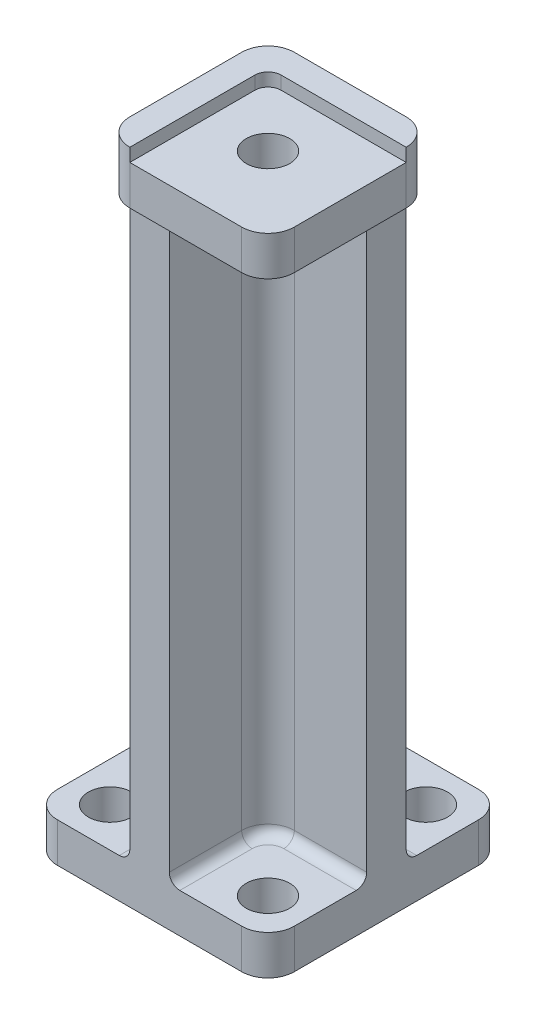
ISO-10303-21;
HEADER;
FILE_DESCRIPTION(('STEP AP214'),'2;1');
FILE_NAME('part.step','',(''),(''),'','','');
FILE_SCHEMA(('AUTOMOTIVE_DESIGN { 1 0 10303 214 1 1 1 1 }'));
ENDSEC;
DATA;
#1=APPLICATION_CONTEXT('core data for automotive mechanical design processes');
#2=APPLICATION_PROTOCOL_DEFINITION('international standard','automotive_design',2000,#1);
#3=PRODUCT_CONTEXT('',#1,'mechanical');
#4=PRODUCT('Part','Part','',(#3));
#5=PRODUCT_RELATED_PRODUCT_CATEGORY('part','',(#4));
#6=PRODUCT_DEFINITION_FORMATION('','',#4);
#7=PRODUCT_DEFINITION_CONTEXT('part definition',#1,'design');
#8=PRODUCT_DEFINITION('design','',#6,#7);
#9=PRODUCT_DEFINITION_SHAPE('','',#8);
#10=(LENGTH_UNIT() NAMED_UNIT(*) SI_UNIT(.MILLI.,.METRE.));
#11=(NAMED_UNIT(*) PLANE_ANGLE_UNIT() SI_UNIT($,.RADIAN.));
#12=(NAMED_UNIT(*) SI_UNIT($,.STERADIAN.) SOLID_ANGLE_UNIT());
#13=UNCERTAINTY_MEASURE_WITH_UNIT(LENGTH_MEASURE(1.E-05),#10,'distance_accuracy_value','');
#14=(GEOMETRIC_REPRESENTATION_CONTEXT(3) GLOBAL_UNCERTAINTY_ASSIGNED_CONTEXT((#13)) GLOBAL_UNIT_ASSIGNED_CONTEXT((#10,
#11,#12)) REPRESENTATION_CONTEXT('',''));
#15=CARTESIAN_POINT('',(0.,0.,0.));
#16=DIRECTION('',(0.,0.,1.));
#17=DIRECTION('',(1.,0.,0.));
#18=AXIS2_PLACEMENT_3D('',#15,#16,#17);
#19=CARTESIAN_POINT('',(0.,51.,0.));
#20=DIRECTION('',(0.,1.,0.));
#21=DIRECTION('',(0.,0.,1.));
#22=AXIS2_PLACEMENT_3D('',#19,#20,#21);
#23=PLANE('',#22);
#24=CARTESIAN_POINT('',(5.,51.,5.));
#25=DIRECTION('',(0.,1.,0.));
#26=DIRECTION('',(0.,0.,1.));
#27=AXIS2_PLACEMENT_3D('',#24,#25,#26);
#28=CIRCLE('',#27,1.65);
#29=CARTESIAN_POINT('',(5.,51.,6.65));
#30=VERTEX_POINT('',#29);
#31=EDGE_CURVE('E284',#30,#30,#28,.T.);
#32=ORIENTED_EDGE('',*,*,#31,.F.);
#33=EDGE_LOOP('',(#32));
#34=FACE_BOUND('',#33,.T.);
#35=DIRECTION('',(1.,0.,0.));
#36=VECTOR('',#35,1.);
#37=CARTESIAN_POINT('',(0.,51.,0.5));
#38=LINE('',#37,#36);
#39=CARTESIAN_POINT('',(1.5,51.,0.5));
#40=VERTEX_POINT('',#39);
#41=CARTESIAN_POINT('',(11.,51.,0.499999999999999));
#42=VERTEX_POINT('',#41);
#43=EDGE_CURVE('E244',#40,#42,#38,.T.);
#44=ORIENTED_EDGE('',*,*,#43,.F.);
#45=CARTESIAN_POINT('',(1.5,51.,1.5));
#46=DIRECTION('',(0.,1.,0.));
#47=DIRECTION('',(0.,0.,1.));
#48=AXIS2_PLACEMENT_3D('',#45,#46,#47);
#49=CIRCLE('',#48,1.);
#50=CARTESIAN_POINT('',(0.500000000000001,51.,1.5));
#51=VERTEX_POINT('',#50);
#52=EDGE_CURVE('E67',#40,#51,#49,.T.);
#53=ORIENTED_EDGE('',*,*,#52,.T.);
#54=DIRECTION('',(0.,0.,1.));
#55=VECTOR('',#54,1.);
#56=CARTESIAN_POINT('',(0.500000000000001,51.,0.));
#57=LINE('',#56,#55);
#58=CARTESIAN_POINT('',(0.500000000000002,51.,11.));
#59=VERTEX_POINT('',#58);
#60=EDGE_CURVE('E268',#51,#59,#57,.T.);
#61=ORIENTED_EDGE('',*,*,#60,.T.);
#62=DIRECTION('',(1.,0.,0.));
#63=VECTOR('',#62,1.);
#64=CARTESIAN_POINT('',(-1.5,51.,11.));
#65=LINE('',#64,#63);
#66=CARTESIAN_POINT('',(9.00000000000001,51.,11.));
#67=VERTEX_POINT('',#66);
#68=EDGE_CURVE('E292',#59,#67,#65,.T.);
#69=ORIENTED_EDGE('',*,*,#68,.T.);
#70=CARTESIAN_POINT('',(9.00000000000001,51.,9.));
#71=DIRECTION('',(0.,1.,0.));
#72=DIRECTION('',(0.,0.,1.));
#73=AXIS2_PLACEMENT_3D('',#70,#71,#72);
#74=CIRCLE('',#73,2.);
#75=CARTESIAN_POINT('',(11.,51.,9.));
#76=VERTEX_POINT('',#75);
#77=EDGE_CURVE('E415',#67,#76,#74,.T.);
#78=ORIENTED_EDGE('',*,*,#77,.T.);
#79=DIRECTION('',(0.,0.,-1.));
#80=VECTOR('',#79,1.);
#81=CARTESIAN_POINT('',(11.,51.,-1.5));
#82=LINE('',#81,#80);
#83=EDGE_CURVE('E295',#76,#42,#82,.T.);
#84=ORIENTED_EDGE('',*,*,#83,.T.);
#85=EDGE_LOOP('',(#44,#53,#61,#69,#78,#84));
#86=FACE_BOUND('',#85,.T.);
#87=ADVANCED_FACE('F45',(#34,#86),#23,.T.);
#88=CARTESIAN_POINT('',(0.,3.,0.));
#89=DIRECTION('',(0.,1.,0.));
#90=DIRECTION('',(0.,0.,1.));
#91=AXIS2_PLACEMENT_3D('',#88,#89,#90);
#92=PLANE('',#91);
#93=CARTESIAN_POINT('',(0.500000000000001,3.,0.5));
#94=DIRECTION('',(0.,1.,0.));
#95=DIRECTION('',(0.,0.,1.));
#96=AXIS2_PLACEMENT_3D('',#93,#94,#95);
#97=CIRCLE('',#96,2.8);
#98=CARTESIAN_POINT('',(-2.3,3.,0.5));
#99=VERTEX_POINT('',#98);
#100=CARTESIAN_POINT('',(0.500000000000001,3.,-2.3));
#101=VERTEX_POINT('',#100);
#102=EDGE_CURVE('E444',#99,#101,#97,.F.);
#103=ORIENTED_EDGE('',*,*,#102,.T.);
#104=DIRECTION('',(1.,0.,0.));
#105=VECTOR('',#104,1.);
#106=CARTESIAN_POINT('',(9.,3.,-2.3));
#107=LINE('',#106,#105);
#108=CARTESIAN_POINT('',(9.,3.,-2.3));
#109=VERTEX_POINT('',#108);
#110=EDGE_CURVE('E446',#101,#109,#107,.T.);
#111=ORIENTED_EDGE('',*,*,#110,.T.);
#112=DIRECTION('',(0.,0.,-1.));
#113=VECTOR('',#112,1.);
#114=CARTESIAN_POINT('',(9.,3.,-9.));
#115=LINE('',#114,#113);
#116=CARTESIAN_POINT('',(9.,3.,-7.));
#117=VERTEX_POINT('',#116);
#118=EDGE_CURVE('E349',#109,#117,#115,.T.);
#119=ORIENTED_EDGE('',*,*,#118,.T.);
#120=CARTESIAN_POINT('',(7.,3.,-7.));
#121=DIRECTION('',(0.,1.,0.));
#122=DIRECTION('',(0.,0.,1.));
#123=AXIS2_PLACEMENT_3D('',#120,#121,#122);
#124=CIRCLE('',#123,2.);
#125=CARTESIAN_POINT('',(7.,3.,-9.));
#126=VERTEX_POINT('',#125);
#127=EDGE_CURVE('E382',#117,#126,#124,.T.);
#128=ORIENTED_EDGE('',*,*,#127,.T.);
#129=DIRECTION('',(-1.,0.,0.));
#130=VECTOR('',#129,1.);
#131=CARTESIAN_POINT('',(-9.,3.,-9.));
#132=LINE('',#131,#130);
#133=CARTESIAN_POINT('',(-0.974802815289284,3.,-9.));
#134=VERTEX_POINT('',#133);
#135=EDGE_CURVE('E348',#126,#134,#132,.T.);
#136=ORIENTED_EDGE('',*,*,#135,.T.);
#137=DIRECTION('',(0.679286233467327,0.,-0.733873431200348));
#138=VECTOR('',#137,1.);
#139=CARTESIAN_POINT('',(-9.,3.,-0.32990085204443));
#140=LINE('',#139,#138);
#141=CARTESIAN_POINT('',(-9.,3.,-0.32990085204443));
#142=VERTEX_POINT('',#141);
#143=EDGE_CURVE('E277',#142,#134,#140,.T.);
#144=ORIENTED_EDGE('',*,*,#143,.F.);
#145=DIRECTION('',(0.,0.,1.));
#146=VECTOR('',#145,1.);
#147=CARTESIAN_POINT('',(-9.,3.,-9.));
#148=LINE('',#147,#146);
#149=CARTESIAN_POINT('',(-8.99999999999999,3.,7.));
#150=VERTEX_POINT('',#149);
#151=EDGE_CURVE('E351',#142,#150,#148,.T.);
#152=ORIENTED_EDGE('',*,*,#151,.T.);
#153=CARTESIAN_POINT('',(-6.99999999999999,3.,7.));
#154=DIRECTION('',(0.,1.,0.));
#155=DIRECTION('',(0.,0.,1.));
#156=AXIS2_PLACEMENT_3D('',#153,#154,#155);
#157=CIRCLE('',#156,2.);
#158=CARTESIAN_POINT('',(-6.99999999999999,3.,9.));
#159=VERTEX_POINT('',#158);
#160=EDGE_CURVE('E384',#150,#159,#157,.T.);
#161=ORIENTED_EDGE('',*,*,#160,.T.);
#162=DIRECTION('',(1.,0.,0.));
#163=VECTOR('',#162,1.);
#164=CARTESIAN_POINT('',(-8.99999999999999,3.,9.));
#165=LINE('',#164,#163);
#166=CARTESIAN_POINT('',(-2.3,3.,9.));
#167=VERTEX_POINT('',#166);
#168=EDGE_CURVE('E355',#159,#167,#165,.T.);
#169=ORIENTED_EDGE('',*,*,#168,.T.);
#170=DIRECTION('',(0.,0.,-1.));
#171=VECTOR('',#170,1.);
#172=CARTESIAN_POINT('',(-2.3,3.,0.5));
#173=LINE('',#172,#171);
#174=EDGE_CURVE('E442',#167,#99,#173,.T.);
#175=ORIENTED_EDGE('',*,*,#174,.T.);
#176=EDGE_LOOP('',(#103,#111,#119,#128,#136,#144,#152,#161,#169,#175));
#177=FACE_BOUND('',#176,.T.);
#178=CARTESIAN_POINT('',(-6.00000000000006,3.,5.99999999999994));
#179=DIRECTION('',(0.,1.,0.));
#180=DIRECTION('',(0.,0.,1.));
#181=AXIS2_PLACEMENT_3D('',#178,#179,#180);
#182=CIRCLE('',#181,1.65);
#183=CARTESIAN_POINT('',(-6.00000000000006,3.,7.64999999999994));
#184=VERTEX_POINT('',#183);
#185=EDGE_CURVE('E340',#184,#184,#182,.T.);
#186=ORIENTED_EDGE('',*,*,#185,.F.);
#187=EDGE_LOOP('',(#186));
#188=FACE_BOUND('',#187,.T.);
#189=CARTESIAN_POINT('',(6.00000000000002,3.,-5.99999999999998));
#190=DIRECTION('',(0.,1.,0.));
#191=DIRECTION('',(0.,0.,1.));
#192=AXIS2_PLACEMENT_3D('',#189,#190,#191);
#193=CIRCLE('',#192,1.65);
#194=CARTESIAN_POINT('',(6.00000000000002,3.,-4.34999999999998));
#195=VERTEX_POINT('',#194);
#196=EDGE_CURVE('E327',#195,#195,#193,.T.);
#197=ORIENTED_EDGE('',*,*,#196,.F.);
#198=EDGE_LOOP('',(#197));
#199=FACE_BOUND('',#198,.T.);
#200=ADVANCED_FACE('F538',(#177,#188,#199),#92,.T.);
#201=CARTESIAN_POINT('',(5.99999999999996,3.,6.00000000000004));
#202=DIRECTION('',(0.,1.,0.));
#203=DIRECTION('',(0.,0.,1.));
#204=AXIS2_PLACEMENT_3D('',#201,#202,#203);
#205=CIRCLE('',#204,1.65);
#206=CARTESIAN_POINT('',(5.99999999999996,3.,7.65000000000004));
#207=VERTEX_POINT('',#206);
#208=EDGE_CURVE('E334',#207,#207,#205,.T.);
#209=ORIENTED_EDGE('',*,*,#208,.F.);
#210=EDGE_LOOP('',(#209));
#211=FACE_BOUND('',#210,.T.);
#212=CARTESIAN_POINT('',(9.00000000000001,3.,7.));
#213=VERTEX_POINT('',#212);
#214=CARTESIAN_POINT('',(9.,3.,2.3));
#215=VERTEX_POINT('',#214);
#216=EDGE_CURVE('E345',#213,#215,#115,.T.);
#217=ORIENTED_EDGE('',*,*,#216,.T.);
#218=DIRECTION('',(-1.,0.,0.));
#219=VECTOR('',#218,1.);
#220=CARTESIAN_POINT('',(3.5,3.,2.3));
#221=LINE('',#220,#219);
#222=CARTESIAN_POINT('',(3.5,3.,2.3));
#223=VERTEX_POINT('',#222);
#224=EDGE_CURVE('E435',#215,#223,#221,.T.);
#225=ORIENTED_EDGE('',*,*,#224,.T.);
#226=CARTESIAN_POINT('',(3.5,3.,3.5));
#227=DIRECTION('',(0.,1.,0.));
#228=DIRECTION('',(0.,0.,1.));
#229=AXIS2_PLACEMENT_3D('',#226,#227,#228);
#230=CIRCLE('',#229,1.2);
#231=CARTESIAN_POINT('',(2.3,3.,3.5));
#232=VERTEX_POINT('',#231);
#233=EDGE_CURVE('E433',#223,#232,#230,.T.);
#234=ORIENTED_EDGE('',*,*,#233,.T.);
#235=DIRECTION('',(0.,0.,-1.));
#236=VECTOR('',#235,1.);
#237=CARTESIAN_POINT('',(2.3,3.,0.));
#238=LINE('',#237,#236);
#239=CARTESIAN_POINT('',(2.3,3.,9.));
#240=VERTEX_POINT('',#239);
#241=EDGE_CURVE('E431',#232,#240,#238,.F.);
#242=ORIENTED_EDGE('',*,*,#241,.T.);
#243=CARTESIAN_POINT('',(7.00000000000001,3.,9.));
#244=VERTEX_POINT('',#243);
#245=EDGE_CURVE('E354',#240,#244,#165,.T.);
#246=ORIENTED_EDGE('',*,*,#245,.T.);
#247=CARTESIAN_POINT('',(7.,3.,7.));
#248=DIRECTION('',(0.,1.,0.));
#249=DIRECTION('',(0.,0.,1.));
#250=AXIS2_PLACEMENT_3D('',#247,#248,#249);
#251=CIRCLE('',#250,2.);
#252=EDGE_CURVE('E392',#244,#213,#251,.T.);
#253=ORIENTED_EDGE('',*,*,#252,.T.);
#254=EDGE_LOOP('',(#217,#225,#234,#242,#246,#253));
#255=FACE_BOUND('',#254,.T.);
#256=ADVANCED_FACE('F516',(#211,#255),#92,.T.);
#257=CARTESIAN_POINT('',(9.,3.,-9.));
#258=DIRECTION('',(-1.,0.,0.));
#259=DIRECTION('',(0.,0.,1.));
#260=AXIS2_PLACEMENT_3D('',#257,#258,#259);
#261=PLANE('',#260);
#262=ORIENTED_EDGE('',*,*,#216,.F.);
#263=DIRECTION('',(0.,-1.,0.));
#264=VECTOR('',#263,1.);
#265=CARTESIAN_POINT('',(9.00000000000001,3.,7.));
#266=LINE('',#265,#264);
#267=CARTESIAN_POINT('',(9.00000000000001,0.,7.));
#268=VERTEX_POINT('',#267);
#269=EDGE_CURVE('E389',#213,#268,#266,.T.);
#270=ORIENTED_EDGE('',*,*,#269,.T.);
#271=DIRECTION('',(0.,0.,-1.));
#272=VECTOR('',#271,1.);
#273=CARTESIAN_POINT('',(9.,0.,-9.));
#274=LINE('',#273,#272);
#275=CARTESIAN_POINT('',(9.,0.,-7.));
#276=VERTEX_POINT('',#275);
#277=EDGE_CURVE('E330',#268,#276,#274,.T.);
#278=ORIENTED_EDGE('',*,*,#277,.T.);
#279=DIRECTION('',(0.,-1.,0.));
#280=VECTOR('',#279,1.);
#281=CARTESIAN_POINT('',(9.,3.,-7.));
#282=LINE('',#281,#280);
#283=EDGE_CURVE('E386',#276,#117,#282,.F.);
#284=ORIENTED_EDGE('',*,*,#283,.T.);
#285=ORIENTED_EDGE('',*,*,#118,.F.);
#286=CARTESIAN_POINT('',(9.,3.8,-2.3));
#287=DIRECTION('',(-1.,0.,0.));
#288=DIRECTION('',(0.,0.,1.));
#289=AXIS2_PLACEMENT_3D('',#286,#287,#288);
#290=CIRCLE('',#289,0.8);
#291=CARTESIAN_POINT('',(9.,3.80000000000001,-1.5));
#292=VERTEX_POINT('',#291);
#293=EDGE_CURVE('E459',#109,#292,#290,.T.);
#294=ORIENTED_EDGE('',*,*,#293,.T.);
#295=DIRECTION('',(0.,-1.,0.));
#296=VECTOR('',#295,1.);
#297=CARTESIAN_POINT('',(9.,48.,-1.5));
#298=LINE('',#297,#296);
#299=CARTESIAN_POINT('',(9.,48.,-1.5));
#300=VERTEX_POINT('',#299);
#301=EDGE_CURVE('E314',#300,#292,#298,.T.);
#302=ORIENTED_EDGE('',*,*,#301,.F.);
#303=DIRECTION('',(0.,0.,-1.));
#304=VECTOR('',#303,1.);
#305=CARTESIAN_POINT('',(9.,48.,0.));
#306=LINE('',#305,#304);
#307=CARTESIAN_POINT('',(9.,48.,1.5));
#308=VERTEX_POINT('',#307);
#309=EDGE_CURVE('E311',#308,#300,#306,.T.);
#310=ORIENTED_EDGE('',*,*,#309,.F.);
#311=DIRECTION('',(0.,-1.,0.));
#312=VECTOR('',#311,1.);
#313=CARTESIAN_POINT('',(9.,48.,1.5));
#314=LINE('',#313,#312);
#315=CARTESIAN_POINT('',(9.,3.80000000000001,1.5));
#316=VERTEX_POINT('',#315);
#317=EDGE_CURVE('E317',#308,#316,#314,.T.);
#318=ORIENTED_EDGE('',*,*,#317,.T.);
#319=CARTESIAN_POINT('',(9.,3.8,2.3));
#320=DIRECTION('',(-1.,0.,0.));
#321=DIRECTION('',(0.,0.,1.));
#322=AXIS2_PLACEMENT_3D('',#319,#320,#321);
#323=CIRCLE('',#322,0.8);
#324=EDGE_CURVE('E457',#316,#215,#323,.T.);
#325=ORIENTED_EDGE('',*,*,#324,.T.);
#326=EDGE_LOOP('',(#262,#270,#278,#284,#285,#294,#302,#310,#318,#325));
#327=FACE_BOUND('',#326,.T.);
#328=ADVANCED_FACE('F491',(#327),#261,.F.);
#329=CARTESIAN_POINT('',(-9.,3.,-9.));
#330=DIRECTION('',(0.,0.,1.));
#331=DIRECTION('',(1.,0.,0.));
#332=AXIS2_PLACEMENT_3D('',#329,#330,#331);
#333=PLANE('',#332);
#334=ORIENTED_EDGE('',*,*,#135,.F.);
#335=DIRECTION('',(0.,-1.,0.));
#336=VECTOR('',#335,1.);
#337=CARTESIAN_POINT('',(7.,3.,-9.));
#338=LINE('',#337,#336);
#339=CARTESIAN_POINT('',(7.,0.,-9.));
#340=VERTEX_POINT('',#339);
#341=EDGE_CURVE('E394',#126,#340,#338,.T.);
#342=ORIENTED_EDGE('',*,*,#341,.T.);
#343=DIRECTION('',(-1.,0.,0.));
#344=VECTOR('',#343,1.);
#345=CARTESIAN_POINT('',(-9.,0.,-9.));
#346=LINE('',#345,#344);
#347=CARTESIAN_POINT('',(-0.974802815289286,0.,-9.));
#348=VERTEX_POINT('',#347);
#349=EDGE_CURVE('E361',#340,#348,#346,.T.);
#350=ORIENTED_EDGE('',*,*,#349,.T.);
#351=DIRECTION('',(0.,1.,0.));
#352=VECTOR('',#351,1.);
#353=CARTESIAN_POINT('',(-0.974802815289284,0.,-9.));
#354=LINE('',#353,#352);
#355=EDGE_CURVE('E281',#348,#134,#354,.T.);
#356=ORIENTED_EDGE('',*,*,#355,.T.);
#357=EDGE_LOOP('',(#334,#342,#350,#356));
#358=FACE_BOUND('',#357,.T.);
#359=ADVANCED_FACE('F534',(#358),#333,.F.);
#360=CARTESIAN_POINT('',(-9.,3.,-9.));
#361=DIRECTION('',(1.,0.,0.));
#362=DIRECTION('',(0.,0.,-1.));
#363=AXIS2_PLACEMENT_3D('',#360,#361,#362);
#364=PLANE('',#363);
#365=DIRECTION('',(0.,0.,1.));
#366=VECTOR('',#365,1.);
#367=CARTESIAN_POINT('',(-9.,0.,-9.));
#368=LINE('',#367,#366);
#369=CARTESIAN_POINT('',(-9.,0.,-0.32990085204443));
#370=VERTEX_POINT('',#369);
#371=CARTESIAN_POINT('',(-8.99999999999999,0.,7.));
#372=VERTEX_POINT('',#371);
#373=EDGE_CURVE('E363',#370,#372,#368,.T.);
#374=ORIENTED_EDGE('',*,*,#373,.T.);
#375=DIRECTION('',(0.,-1.,0.));
#376=VECTOR('',#375,1.);
#377=CARTESIAN_POINT('',(-8.99999999999999,3.,7.));
#378=LINE('',#377,#376);
#379=EDGE_CURVE('E380',#372,#150,#378,.F.);
#380=ORIENTED_EDGE('',*,*,#379,.T.);
#381=ORIENTED_EDGE('',*,*,#151,.F.);
#382=DIRECTION('',(0.,1.,0.));
#383=VECTOR('',#382,1.);
#384=CARTESIAN_POINT('',(-9.,0.,-0.32990085204443));
#385=LINE('',#384,#383);
#386=EDGE_CURVE('E276',#370,#142,#385,.T.);
#387=ORIENTED_EDGE('',*,*,#386,.F.);
#388=EDGE_LOOP('',(#374,#380,#381,#387));
#389=FACE_BOUND('',#388,.T.);
#390=ADVANCED_FACE('F546',(#389),#364,.F.);
#391=CARTESIAN_POINT('',(-8.99999999999999,3.,9.));
#392=DIRECTION('',(0.,0.,-1.));
#393=DIRECTION('',(-1.,0.,0.));
#394=AXIS2_PLACEMENT_3D('',#391,#392,#393);
#395=PLANE('',#394);
#396=ORIENTED_EDGE('',*,*,#168,.F.);
#397=DIRECTION('',(0.,-1.,0.));
#398=VECTOR('',#397,1.);
#399=CARTESIAN_POINT('',(-6.99999999999999,3.,9.));
#400=LINE('',#399,#398);
#401=CARTESIAN_POINT('',(-6.99999999999999,0.,9.));
#402=VERTEX_POINT('',#401);
#403=EDGE_CURVE('E371',#159,#402,#400,.T.);
#404=ORIENTED_EDGE('',*,*,#403,.T.);
#405=DIRECTION('',(1.,0.,0.));
#406=VECTOR('',#405,1.);
#407=CARTESIAN_POINT('',(-8.99999999999999,0.,9.));
#408=LINE('',#407,#406);
#409=CARTESIAN_POINT('',(7.00000000000001,0.,9.));
#410=VERTEX_POINT('',#409);
#411=EDGE_CURVE('E366',#402,#410,#408,.T.);
#412=ORIENTED_EDGE('',*,*,#411,.T.);
#413=DIRECTION('',(0.,-1.,0.));
#414=VECTOR('',#413,1.);
#415=CARTESIAN_POINT('',(7.00000000000001,3.,9.));
#416=LINE('',#415,#414);
#417=EDGE_CURVE('E358',#410,#244,#416,.F.);
#418=ORIENTED_EDGE('',*,*,#417,.T.);
#419=ORIENTED_EDGE('',*,*,#245,.F.);
#420=CARTESIAN_POINT('',(2.3,3.8,9.));
#421=DIRECTION('',(0.,0.,-1.));
#422=DIRECTION('',(-1.,0.,0.));
#423=AXIS2_PLACEMENT_3D('',#420,#421,#422);
#424=CIRCLE('',#423,0.8);
#425=CARTESIAN_POINT('',(1.5,3.80000000000001,9.));
#426=VERTEX_POINT('',#425);
#427=EDGE_CURVE('E461',#240,#426,#424,.T.);
#428=ORIENTED_EDGE('',*,*,#427,.T.);
#429=DIRECTION('',(0.,-1.,0.));
#430=VECTOR('',#429,1.);
#431=CARTESIAN_POINT('',(1.5,48.,9.));
#432=LINE('',#431,#430);
#433=CARTESIAN_POINT('',(1.5,48.,9.));
#434=VERTEX_POINT('',#433);
#435=EDGE_CURVE('E320',#434,#426,#432,.T.);
#436=ORIENTED_EDGE('',*,*,#435,.F.);
#437=DIRECTION('',(1.,0.,0.));
#438=VECTOR('',#437,1.);
#439=CARTESIAN_POINT('',(0.,48.,9.));
#440=LINE('',#439,#438);
#441=CARTESIAN_POINT('',(-1.5,48.,9.));
#442=VERTEX_POINT('',#441);
#443=EDGE_CURVE('E298',#442,#434,#440,.T.);
#444=ORIENTED_EDGE('',*,*,#443,.F.);
#445=DIRECTION('',(0.,-1.,0.));
#446=VECTOR('',#445,1.);
#447=CARTESIAN_POINT('',(-1.5,48.,9.));
#448=LINE('',#447,#446);
#449=CARTESIAN_POINT('',(-1.5,3.80000000000001,9.));
#450=VERTEX_POINT('',#449);
#451=EDGE_CURVE('E323',#442,#450,#448,.T.);
#452=ORIENTED_EDGE('',*,*,#451,.T.);
#453=CARTESIAN_POINT('',(-2.3,3.8,9.));
#454=DIRECTION('',(0.,0.,-1.));
#455=DIRECTION('',(-1.,0.,0.));
#456=AXIS2_PLACEMENT_3D('',#453,#454,#455);
#457=CIRCLE('',#456,0.8);
#458=EDGE_CURVE('E463',#450,#167,#457,.T.);
#459=ORIENTED_EDGE('',*,*,#458,.T.);
#460=EDGE_LOOP('',(#396,#404,#412,#418,#419,#428,#436,#444,#452,#459));
#461=FACE_BOUND('',#460,.T.);
#462=ADVANCED_FACE('F554',(#461),#395,.F.);
#463=CARTESIAN_POINT('',(0.,0.,0.));
#464=DIRECTION('',(0.,1.,0.));
#465=DIRECTION('',(0.,0.,1.));
#466=AXIS2_PLACEMENT_3D('',#463,#464,#465);
#467=PLANE('',#466);
#468=CARTESIAN_POINT('',(-6.00000000000006,0.,5.99999999999994));
#469=DIRECTION('',(0.,1.,0.));
#470=DIRECTION('',(0.,0.,1.));
#471=AXIS2_PLACEMENT_3D('',#468,#469,#470);
#472=CIRCLE('',#471,1.65);
#473=CARTESIAN_POINT('',(-6.00000000000006,0.,7.64999999999994));
#474=VERTEX_POINT('',#473);
#475=EDGE_CURVE('E326',#474,#474,#472,.T.);
#476=ORIENTED_EDGE('',*,*,#475,.T.);
#477=EDGE_LOOP('',(#476));
#478=FACE_BOUND('',#477,.T.);
#479=CARTESIAN_POINT('',(5.99999999999996,0.,6.00000000000004));
#480=DIRECTION('',(0.,1.,0.));
#481=DIRECTION('',(0.,0.,1.));
#482=AXIS2_PLACEMENT_3D('',#479,#480,#481);
#483=CIRCLE('',#482,1.65);
#484=CARTESIAN_POINT('',(5.99999999999996,0.,7.65000000000004));
#485=VERTEX_POINT('',#484);
#486=EDGE_CURVE('E337',#485,#485,#483,.T.);
#487=ORIENTED_EDGE('',*,*,#486,.T.);
#488=EDGE_LOOP('',(#487));
#489=FACE_BOUND('',#488,.T.);
#490=CARTESIAN_POINT('',(6.00000000000002,0.,-5.99999999999998));
#491=DIRECTION('',(0.,1.,0.));
#492=DIRECTION('',(0.,0.,1.));
#493=AXIS2_PLACEMENT_3D('',#490,#491,#492);
#494=CIRCLE('',#493,1.65);
#495=CARTESIAN_POINT('',(6.00000000000002,0.,-4.34999999999998));
#496=VERTEX_POINT('',#495);
#497=EDGE_CURVE('E331',#496,#496,#494,.T.);
#498=ORIENTED_EDGE('',*,*,#497,.T.);
#499=EDGE_LOOP('',(#498));
#500=FACE_BOUND('',#499,.T.);
#501=ORIENTED_EDGE('',*,*,#411,.F.);
#502=CARTESIAN_POINT('',(-6.99999999999999,0.,7.));
#503=DIRECTION('',(0.,1.,0.));
#504=DIRECTION('',(0.,0.,1.));
#505=AXIS2_PLACEMENT_3D('',#502,#503,#504);
#506=CIRCLE('',#505,2.);
#507=EDGE_CURVE('E378',#402,#372,#506,.F.);
#508=ORIENTED_EDGE('',*,*,#507,.T.);
#509=ORIENTED_EDGE('',*,*,#373,.F.);
#510=DIRECTION('',(0.679286233467327,0.,-0.733873431200348));
#511=VECTOR('',#510,1.);
#512=CARTESIAN_POINT('',(-9.,0.,-0.32990085204443));
#513=LINE('',#512,#511);
#514=EDGE_CURVE('E273',#370,#348,#513,.T.);
#515=ORIENTED_EDGE('',*,*,#514,.T.);
#516=ORIENTED_EDGE('',*,*,#349,.F.);
#517=CARTESIAN_POINT('',(7.,0.,-7.));
#518=DIRECTION('',(0.,1.,0.));
#519=DIRECTION('',(0.,0.,1.));
#520=AXIS2_PLACEMENT_3D('',#517,#518,#519);
#521=CIRCLE('',#520,2.);
#522=EDGE_CURVE('E374',#340,#276,#521,.F.);
#523=ORIENTED_EDGE('',*,*,#522,.T.);
#524=ORIENTED_EDGE('',*,*,#277,.F.);
#525=CARTESIAN_POINT('',(7.,0.,7.));
#526=DIRECTION('',(0.,1.,0.));
#527=DIRECTION('',(0.,0.,1.));
#528=AXIS2_PLACEMENT_3D('',#525,#526,#527);
#529=CIRCLE('',#528,2.);
#530=EDGE_CURVE('E376',#268,#410,#529,.F.);
#531=ORIENTED_EDGE('',*,*,#530,.T.);
#532=EDGE_LOOP('',(#501,#508,#509,#515,#516,#523,#524,#531));
#533=FACE_BOUND('',#532,.T.);
#534=ADVANCED_FACE('F526',(#478,#489,#500,#533),#467,.F.);
#535=CARTESIAN_POINT('',(6.00000000000002,0.,-5.99999999999998));
#536=DIRECTION('',(0.,1.,0.));
#537=DIRECTION('',(0.,0.,1.));
#538=AXIS2_PLACEMENT_3D('',#535,#536,#537);
#539=CYLINDRICAL_SURFACE('',#538,1.65);
#540=ORIENTED_EDGE('',*,*,#497,.F.);
#541=EDGE_LOOP('',(#540));
#542=FACE_BOUND('',#541,.T.);
#543=ORIENTED_EDGE('',*,*,#196,.T.);
#544=EDGE_LOOP('',(#543));
#545=FACE_BOUND('',#544,.T.);
#546=ADVANCED_FACE('F623',(#542,#545),#539,.F.);
#547=CARTESIAN_POINT('',(5.99999999999996,0.,6.00000000000004));
#548=DIRECTION('',(0.,1.,0.));
#549=DIRECTION('',(0.,0.,1.));
#550=AXIS2_PLACEMENT_3D('',#547,#548,#549);
#551=CYLINDRICAL_SURFACE('',#550,1.65);
#552=ORIENTED_EDGE('',*,*,#486,.F.);
#553=EDGE_LOOP('',(#552));
#554=FACE_BOUND('',#553,.T.);
#555=ORIENTED_EDGE('',*,*,#208,.T.);
#556=EDGE_LOOP('',(#555));
#557=FACE_BOUND('',#556,.T.);
#558=ADVANCED_FACE('F626',(#554,#557),#551,.F.);
#559=CARTESIAN_POINT('',(-6.00000000000006,0.,5.99999999999994));
#560=DIRECTION('',(0.,1.,0.));
#561=DIRECTION('',(0.,0.,1.));
#562=AXIS2_PLACEMENT_3D('',#559,#560,#561);
#563=CYLINDRICAL_SURFACE('',#562,1.65);
#564=ORIENTED_EDGE('',*,*,#475,.F.);
#565=EDGE_LOOP('',(#564));
#566=FACE_BOUND('',#565,.T.);
#567=ORIENTED_EDGE('',*,*,#185,.T.);
#568=EDGE_LOOP('',(#567));
#569=FACE_BOUND('',#568,.T.);
#570=ADVANCED_FACE('F622',(#566,#569),#563,.F.);
#571=CARTESIAN_POINT('',(-1.5,48.,0.));
#572=DIRECTION('',(-1.,0.,0.));
#573=DIRECTION('',(0.,0.,1.));
#574=AXIS2_PLACEMENT_3D('',#571,#572,#573);
#575=PLANE('',#574);
#576=DIRECTION('',(0.,-1.,0.));
#577=VECTOR('',#576,1.);
#578=CARTESIAN_POINT('',(-1.5,48.,0.5));
#579=LINE('',#578,#577);
#580=CARTESIAN_POINT('',(-1.5,52.,0.5));
#581=VERTEX_POINT('',#580);
#582=CARTESIAN_POINT('',(-1.5,3.8,0.5));
#583=VERTEX_POINT('',#582);
#584=EDGE_CURVE('E410',#581,#583,#579,.T.);
#585=ORIENTED_EDGE('',*,*,#584,.T.);
#586=DIRECTION('',(0.,0.,-1.));
#587=VECTOR('',#586,1.);
#588=CARTESIAN_POINT('',(-1.5,3.8,9.));
#589=LINE('',#588,#587);
#590=EDGE_CURVE('E455',#583,#450,#589,.F.);
#591=ORIENTED_EDGE('',*,*,#590,.T.);
#592=ORIENTED_EDGE('',*,*,#451,.F.);
#593=DIRECTION('',(0.,-1.,0.));
#594=VECTOR('',#593,1.);
#595=CARTESIAN_POINT('',(-1.5,51.,9.));
#596=LINE('',#595,#594);
#597=CARTESIAN_POINT('',(-1.5,52.,9.));
#598=VERTEX_POINT('',#597);
#599=EDGE_CURVE('E413',#442,#598,#596,.F.);
#600=ORIENTED_EDGE('',*,*,#599,.T.);
#601=DIRECTION('',(0.,0.,1.));
#602=VECTOR('',#601,1.);
#603=CARTESIAN_POINT('',(-1.5,52.,0.));
#604=LINE('',#603,#602);
#605=EDGE_CURVE('E262',#581,#598,#604,.T.);
#606=ORIENTED_EDGE('',*,*,#605,.F.);
#607=EDGE_LOOP('',(#585,#591,#592,#600,#606));
#608=FACE_BOUND('',#607,.T.);
#609=ADVANCED_FACE('F576',(#608),#575,.T.);
#610=CARTESIAN_POINT('',(1.5,48.,0.));
#611=DIRECTION('',(-1.,0.,0.));
#612=DIRECTION('',(0.,0.,1.));
#613=AXIS2_PLACEMENT_3D('',#610,#611,#612);
#614=PLANE('',#613);
#615=ORIENTED_EDGE('',*,*,#435,.T.);
#616=DIRECTION('',(0.,0.,-1.));
#617=VECTOR('',#616,1.);
#618=CARTESIAN_POINT('',(1.5,3.8,0.));
#619=LINE('',#618,#617);
#620=CARTESIAN_POINT('',(1.5,3.8,3.5));
#621=VERTEX_POINT('',#620);
#622=EDGE_CURVE('E453',#426,#621,#619,.T.);
#623=ORIENTED_EDGE('',*,*,#622,.T.);
#624=DIRECTION('',(0.,-1.,0.));
#625=VECTOR('',#624,1.);
#626=CARTESIAN_POINT('',(1.5,48.,3.5));
#627=LINE('',#626,#625);
#628=CARTESIAN_POINT('',(1.5,48.,3.5));
#629=VERTEX_POINT('',#628);
#630=EDGE_CURVE('E429',#621,#629,#627,.F.);
#631=ORIENTED_EDGE('',*,*,#630,.T.);
#632=DIRECTION('',(0.,0.,-1.));
#633=VECTOR('',#632,1.);
#634=CARTESIAN_POINT('',(1.5,48.,0.));
#635=LINE('',#634,#633);
#636=EDGE_CURVE('E305',#434,#629,#635,.T.);
#637=ORIENTED_EDGE('',*,*,#636,.F.);
#638=EDGE_LOOP('',(#615,#623,#631,#637));
#639=FACE_BOUND('',#638,.T.);
#640=ADVANCED_FACE('F616',(#639),#614,.F.);
#641=CARTESIAN_POINT('',(0.,48.,1.5));
#642=DIRECTION('',(0.,0.,1.));
#643=DIRECTION('',(1.,0.,0.));
#644=AXIS2_PLACEMENT_3D('',#641,#642,#643);
#645=PLANE('',#644);
#646=DIRECTION('',(0.,-1.,0.));
#647=VECTOR('',#646,1.);
#648=CARTESIAN_POINT('',(3.5,48.,1.5));
#649=LINE('',#648,#647);
#650=CARTESIAN_POINT('',(3.5,48.,1.5));
#651=VERTEX_POINT('',#650);
#652=CARTESIAN_POINT('',(3.5,3.8,1.5));
#653=VERTEX_POINT('',#652);
#654=EDGE_CURVE('E426',#651,#653,#649,.T.);
#655=ORIENTED_EDGE('',*,*,#654,.T.);
#656=DIRECTION('',(-1.,0.,0.));
#657=VECTOR('',#656,1.);
#658=CARTESIAN_POINT('',(9.,3.8,1.5));
#659=LINE('',#658,#657);
#660=EDGE_CURVE('E438',#653,#316,#659,.F.);
#661=ORIENTED_EDGE('',*,*,#660,.T.);
#662=ORIENTED_EDGE('',*,*,#317,.F.);
#663=DIRECTION('',(-1.,0.,0.));
#664=VECTOR('',#663,1.);
#665=CARTESIAN_POINT('',(0.,48.,1.5));
#666=LINE('',#665,#664);
#667=EDGE_CURVE('E308',#308,#651,#666,.T.);
#668=ORIENTED_EDGE('',*,*,#667,.T.);
#669=EDGE_LOOP('',(#655,#661,#662,#668));
#670=FACE_BOUND('',#669,.T.);
#671=ADVANCED_FACE('F499',(#670),#645,.T.);
#672=CARTESIAN_POINT('',(0.,48.,-1.5));
#673=DIRECTION('',(0.,0.,-1.));
#674=DIRECTION('',(-1.,0.,0.));
#675=AXIS2_PLACEMENT_3D('',#672,#673,#674);
#676=PLANE('',#675);
#677=ORIENTED_EDGE('',*,*,#301,.T.);
#678=DIRECTION('',(1.,0.,0.));
#679=VECTOR('',#678,1.);
#680=CARTESIAN_POINT('',(0.500000000000001,3.8,-1.5));
#681=LINE('',#680,#679);
#682=CARTESIAN_POINT('',(0.500000000000001,3.8,-1.5));
#683=VERTEX_POINT('',#682);
#684=EDGE_CURVE('E449',#292,#683,#681,.F.);
#685=ORIENTED_EDGE('',*,*,#684,.T.);
#686=DIRECTION('',(0.,-1.,0.));
#687=VECTOR('',#686,1.);
#688=CARTESIAN_POINT('',(0.500000000000001,48.,-1.5));
#689=LINE('',#688,#687);
#690=CARTESIAN_POINT('',(0.500000000000002,52.,-1.5));
#691=VERTEX_POINT('',#690);
#692=EDGE_CURVE('E423',#683,#691,#689,.F.);
#693=ORIENTED_EDGE('',*,*,#692,.T.);
#694=DIRECTION('',(-1.,0.,0.));
#695=VECTOR('',#694,1.);
#696=CARTESIAN_POINT('',(0.,52.,-1.5));
#697=LINE('',#696,#695);
#698=CARTESIAN_POINT('',(9.,52.,-1.5));
#699=VERTEX_POINT('',#698);
#700=EDGE_CURVE('E254',#699,#691,#697,.T.);
#701=ORIENTED_EDGE('',*,*,#700,.F.);
#702=DIRECTION('',(0.,-1.,0.));
#703=VECTOR('',#702,1.);
#704=CARTESIAN_POINT('',(9.,48.,-1.5));
#705=LINE('',#704,#703);
#706=EDGE_CURVE('E253',#699,#300,#705,.T.);
#707=ORIENTED_EDGE('',*,*,#706,.T.);
#708=EDGE_LOOP('',(#677,#685,#693,#701,#707));
#709=FACE_BOUND('',#708,.T.);
#710=ADVANCED_FACE('F486',(#709),#676,.T.);
#711=CARTESIAN_POINT('',(0.,48.,0.));
#712=DIRECTION('',(0.,1.,0.));
#713=DIRECTION('',(0.,0.,1.));
#714=AXIS2_PLACEMENT_3D('',#711,#712,#713);
#715=PLANE('',#714);
#716=CARTESIAN_POINT('',(5.,48.,5.));
#717=DIRECTION('',(0.,1.,0.));
#718=DIRECTION('',(0.,0.,1.));
#719=AXIS2_PLACEMENT_3D('',#716,#717,#718);
#720=CIRCLE('',#719,1.65);
#721=CARTESIAN_POINT('',(5.,48.,6.65));
#722=VERTEX_POINT('',#721);
#723=EDGE_CURVE('E286',#722,#722,#720,.T.);
#724=ORIENTED_EDGE('',*,*,#723,.T.);
#725=EDGE_LOOP('',(#724));
#726=FACE_BOUND('',#725,.T.);
#727=DIRECTION('',(1.,0.,0.));
#728=VECTOR('',#727,1.);
#729=CARTESIAN_POINT('',(-1.5,48.,11.));
#730=LINE('',#729,#728);
#731=CARTESIAN_POINT('',(0.500000000000002,48.,11.));
#732=VERTEX_POINT('',#731);
#733=CARTESIAN_POINT('',(9.00000000000001,48.,11.));
#734=VERTEX_POINT('',#733);
#735=EDGE_CURVE('E289',#732,#734,#730,.T.);
#736=ORIENTED_EDGE('',*,*,#735,.F.);
#737=CARTESIAN_POINT('',(0.500000000000002,48.,9.));
#738=DIRECTION('',(0.,1.,0.));
#739=DIRECTION('',(0.,0.,1.));
#740=AXIS2_PLACEMENT_3D('',#737,#738,#739);
#741=CIRCLE('',#740,2.);
#742=EDGE_CURVE('E408',#732,#442,#741,.F.);
#743=ORIENTED_EDGE('',*,*,#742,.T.);
#744=ORIENTED_EDGE('',*,*,#443,.T.);
#745=ORIENTED_EDGE('',*,*,#636,.T.);
#746=CARTESIAN_POINT('',(3.5,48.,3.5));
#747=DIRECTION('',(0.,1.,0.));
#748=DIRECTION('',(0.,0.,1.));
#749=AXIS2_PLACEMENT_3D('',#746,#747,#748);
#750=CIRCLE('',#749,2.);
#751=EDGE_CURVE('E402',#629,#651,#750,.F.);
#752=ORIENTED_EDGE('',*,*,#751,.T.);
#753=ORIENTED_EDGE('',*,*,#667,.F.);
#754=ORIENTED_EDGE('',*,*,#309,.T.);
#755=CARTESIAN_POINT('',(9.,48.,0.499999999999999));
#756=DIRECTION('',(0.,1.,0.));
#757=DIRECTION('',(0.,0.,1.));
#758=AXIS2_PLACEMENT_3D('',#755,#756,#757);
#759=CIRCLE('',#758,2.);
#760=CARTESIAN_POINT('',(11.,48.,0.499999999999999));
#761=VERTEX_POINT('',#760);
#762=EDGE_CURVE('E404',#300,#761,#759,.F.);
#763=ORIENTED_EDGE('',*,*,#762,.T.);
#764=DIRECTION('',(0.,0.,-1.));
#765=VECTOR('',#764,1.);
#766=CARTESIAN_POINT('',(11.,48.,-1.5));
#767=LINE('',#766,#765);
#768=CARTESIAN_POINT('',(11.,48.,9.));
#769=VERTEX_POINT('',#768);
#770=EDGE_CURVE('E296',#769,#761,#767,.T.);
#771=ORIENTED_EDGE('',*,*,#770,.F.);
#772=CARTESIAN_POINT('',(9.00000000000001,48.,9.));
#773=DIRECTION('',(0.,1.,0.));
#774=DIRECTION('',(0.,0.,1.));
#775=AXIS2_PLACEMENT_3D('',#772,#773,#774);
#776=CIRCLE('',#775,2.);
#777=EDGE_CURVE('E406',#769,#734,#776,.F.);
#778=ORIENTED_EDGE('',*,*,#777,.T.);
#779=EDGE_LOOP('',(#736,#743,#744,#745,#752,#753,#754,#763,#771,#778));
#780=FACE_BOUND('',#779,.T.);
#781=ADVANCED_FACE('F495',(#726,#780),#715,.F.);
#782=CARTESIAN_POINT('',(-1.5,51.,11.));
#783=DIRECTION('',(0.,0.,-1.));
#784=DIRECTION('',(-1.,0.,0.));
#785=AXIS2_PLACEMENT_3D('',#782,#783,#784);
#786=PLANE('',#785);
#787=ORIENTED_EDGE('',*,*,#68,.F.);
#788=DIRECTION('',(0.,-1.,0.));
#789=VECTOR('',#788,1.);
#790=CARTESIAN_POINT('',(0.500000000000002,48.,11.));
#791=LINE('',#790,#789);
#792=EDGE_CURVE('E399',#59,#732,#791,.T.);
#793=ORIENTED_EDGE('',*,*,#792,.T.);
#794=ORIENTED_EDGE('',*,*,#735,.T.);
#795=DIRECTION('',(0.,-1.,0.));
#796=VECTOR('',#795,1.);
#797=CARTESIAN_POINT('',(9.00000000000001,51.,11.));
#798=LINE('',#797,#796);
#799=EDGE_CURVE('E397',#734,#67,#798,.F.);
#800=ORIENTED_EDGE('',*,*,#799,.T.);
#801=EDGE_LOOP('',(#787,#793,#794,#800));
#802=FACE_BOUND('',#801,.T.);
#803=ADVANCED_FACE('F605',(#802),#786,.F.);
#804=CARTESIAN_POINT('',(11.,51.,-1.5));
#805=DIRECTION('',(-1.,0.,0.));
#806=DIRECTION('',(0.,0.,1.));
#807=AXIS2_PLACEMENT_3D('',#804,#805,#806);
#808=PLANE('',#807);
#809=ORIENTED_EDGE('',*,*,#83,.F.);
#810=DIRECTION('',(0.,-1.,0.));
#811=VECTOR('',#810,1.);
#812=CARTESIAN_POINT('',(11.,51.,9.));
#813=LINE('',#812,#811);
#814=EDGE_CURVE('E420',#76,#769,#813,.T.);
#815=ORIENTED_EDGE('',*,*,#814,.T.);
#816=ORIENTED_EDGE('',*,*,#770,.T.);
#817=DIRECTION('',(0.,-1.,0.));
#818=VECTOR('',#817,1.);
#819=CARTESIAN_POINT('',(11.,51.,0.499999999999999));
#820=LINE('',#819,#818);
#821=EDGE_CURVE('E417',#761,#42,#820,.F.);
#822=ORIENTED_EDGE('',*,*,#821,.T.);
#823=EDGE_LOOP('',(#809,#815,#816,#822));
#824=FACE_BOUND('',#823,.T.);
#825=ADVANCED_FACE('F481',(#824),#808,.F.);
#826=CARTESIAN_POINT('',(5.,48.,5.));
#827=DIRECTION('',(0.,1.,0.));
#828=DIRECTION('',(0.,0.,1.));
#829=AXIS2_PLACEMENT_3D('',#826,#827,#828);
#830=CYLINDRICAL_SURFACE('',#829,1.65);
#831=ORIENTED_EDGE('',*,*,#723,.F.);
#832=EDGE_LOOP('',(#831));
#833=FACE_BOUND('',#832,.T.);
#834=ORIENTED_EDGE('',*,*,#31,.T.);
#835=EDGE_LOOP('',(#834));
#836=FACE_BOUND('',#835,.T.);
#837=ADVANCED_FACE('F601',(#833,#836),#830,.F.);
#838=CARTESIAN_POINT('',(-9.,0.,-0.32990085204443));
#839=DIRECTION('',(0.733873431200348,0.,0.679286233467327));
#840=DIRECTION('',(0.679286233467327,0.,-0.733873431200348));
#841=AXIS2_PLACEMENT_3D('',#838,#839,#840);
#842=PLANE('',#841);
#843=ORIENTED_EDGE('',*,*,#143,.T.);
#844=ORIENTED_EDGE('',*,*,#355,.F.);
#845=ORIENTED_EDGE('',*,*,#514,.F.);
#846=ORIENTED_EDGE('',*,*,#386,.T.);
#847=EDGE_LOOP('',(#843,#844,#845,#846));
#848=FACE_BOUND('',#847,.T.);
#849=ADVANCED_FACE('F542',(#848),#842,.F.);
#850=CARTESIAN_POINT('',(-6.99999999999999,3.,7.));
#851=DIRECTION('',(0.,-1.,0.));
#852=DIRECTION('',(0.,0.,-1.));
#853=AXIS2_PLACEMENT_3D('',#850,#851,#852);
#854=CYLINDRICAL_SURFACE('',#853,2.);
#855=ORIENTED_EDGE('',*,*,#160,.F.);
#856=ORIENTED_EDGE('',*,*,#379,.F.);
#857=ORIENTED_EDGE('',*,*,#507,.F.);
#858=ORIENTED_EDGE('',*,*,#403,.F.);
#859=EDGE_LOOP('',(#855,#856,#857,#858));
#860=FACE_BOUND('',#859,.T.);
#861=ADVANCED_FACE('F551',(#860),#854,.T.);
#862=CARTESIAN_POINT('',(7.,3.,7.));
#863=DIRECTION('',(0.,-1.,0.));
#864=DIRECTION('',(0.,0.,-1.));
#865=AXIS2_PLACEMENT_3D('',#862,#863,#864);
#866=CYLINDRICAL_SURFACE('',#865,2.);
#867=ORIENTED_EDGE('',*,*,#252,.F.);
#868=ORIENTED_EDGE('',*,*,#417,.F.);
#869=ORIENTED_EDGE('',*,*,#530,.F.);
#870=ORIENTED_EDGE('',*,*,#269,.F.);
#871=EDGE_LOOP('',(#867,#868,#869,#870));
#872=FACE_BOUND('',#871,.T.);
#873=ADVANCED_FACE('F521',(#872),#866,.T.);
#874=CARTESIAN_POINT('',(7.,3.,-7.));
#875=DIRECTION('',(0.,-1.,0.));
#876=DIRECTION('',(0.,0.,-1.));
#877=AXIS2_PLACEMENT_3D('',#874,#875,#876);
#878=CYLINDRICAL_SURFACE('',#877,2.);
#879=ORIENTED_EDGE('',*,*,#127,.F.);
#880=ORIENTED_EDGE('',*,*,#283,.F.);
#881=ORIENTED_EDGE('',*,*,#522,.F.);
#882=ORIENTED_EDGE('',*,*,#341,.F.);
#883=EDGE_LOOP('',(#879,#880,#881,#882));
#884=FACE_BOUND('',#883,.T.);
#885=ADVANCED_FACE('F531',(#884),#878,.T.);
#886=CARTESIAN_POINT('',(0.500000000000002,51.,9.));
#887=DIRECTION('',(0.,1.,0.));
#888=DIRECTION('',(0.,0.,1.));
#889=AXIS2_PLACEMENT_3D('',#886,#887,#888);
#890=CYLINDRICAL_SURFACE('',#889,2.);
#891=ORIENTED_EDGE('',*,*,#792,.F.);
#892=DIRECTION('',(0.,-1.,0.));
#893=VECTOR('',#892,1.);
#894=CARTESIAN_POINT('',(0.500000000000002,52.,11.));
#895=LINE('',#894,#893);
#896=CARTESIAN_POINT('',(0.500000000000002,52.,11.));
#897=VERTEX_POINT('',#896);
#898=EDGE_CURVE('E249',#897,#59,#895,.T.);
#899=ORIENTED_EDGE('',*,*,#898,.F.);
#900=CARTESIAN_POINT('',(0.500000000000002,52.,9.));
#901=DIRECTION('',(0.,1.,0.));
#902=DIRECTION('',(0.,0.,1.));
#903=AXIS2_PLACEMENT_3D('',#900,#901,#902);
#904=CIRCLE('',#903,2.);
#905=EDGE_CURVE('E265',#598,#897,#904,.T.);
#906=ORIENTED_EDGE('',*,*,#905,.F.);
#907=ORIENTED_EDGE('',*,*,#599,.F.);
#908=ORIENTED_EDGE('',*,*,#742,.F.);
#909=EDGE_LOOP('',(#891,#899,#906,#907,#908));
#910=FACE_BOUND('',#909,.T.);
#911=ADVANCED_FACE('F582',(#910),#890,.T.);
#912=CARTESIAN_POINT('',(9.00000000000001,51.,9.));
#913=DIRECTION('',(0.,-1.,0.));
#914=DIRECTION('',(0.,0.,-1.));
#915=AXIS2_PLACEMENT_3D('',#912,#913,#914);
#916=CYLINDRICAL_SURFACE('',#915,2.);
#917=ORIENTED_EDGE('',*,*,#77,.F.);
#918=ORIENTED_EDGE('',*,*,#799,.F.);
#919=ORIENTED_EDGE('',*,*,#777,.F.);
#920=ORIENTED_EDGE('',*,*,#814,.F.);
#921=EDGE_LOOP('',(#917,#918,#919,#920));
#922=FACE_BOUND('',#921,.T.);
#923=ADVANCED_FACE('F653',(#922),#916,.T.);
#924=CARTESIAN_POINT('',(9.,48.,0.499999999999999));
#925=DIRECTION('',(0.,1.,0.));
#926=DIRECTION('',(0.,0.,1.));
#927=AXIS2_PLACEMENT_3D('',#924,#925,#926);
#928=CYLINDRICAL_SURFACE('',#927,2.);
#929=ORIENTED_EDGE('',*,*,#706,.F.);
#930=CARTESIAN_POINT('',(9.,52.,0.499999999999999));
#931=DIRECTION('',(0.,1.,0.));
#932=DIRECTION('',(0.,0.,1.));
#933=AXIS2_PLACEMENT_3D('',#930,#931,#932);
#934=CIRCLE('',#933,2.);
#935=CARTESIAN_POINT('',(11.,52.,0.499999999999999));
#936=VERTEX_POINT('',#935);
#937=EDGE_CURVE('E233',#936,#699,#934,.T.);
#938=ORIENTED_EDGE('',*,*,#937,.F.);
#939=DIRECTION('',(0.,-1.,0.));
#940=VECTOR('',#939,1.);
#941=CARTESIAN_POINT('',(11.,52.,0.499999999999999));
#942=LINE('',#941,#940);
#943=EDGE_CURVE('E242',#936,#42,#942,.T.);
#944=ORIENTED_EDGE('',*,*,#943,.T.);
#945=ORIENTED_EDGE('',*,*,#821,.F.);
#946=ORIENTED_EDGE('',*,*,#762,.F.);
#947=EDGE_LOOP('',(#929,#938,#944,#945,#946));
#948=FACE_BOUND('',#947,.T.);
#949=ADVANCED_FACE('F251',(#948),#928,.T.);
#950=CARTESIAN_POINT('',(3.5,48.,3.5));
#951=DIRECTION('',(0.,-1.,0.));
#952=DIRECTION('',(0.,0.,-1.));
#953=AXIS2_PLACEMENT_3D('',#950,#951,#952);
#954=CYLINDRICAL_SURFACE('',#953,2.);
#955=ORIENTED_EDGE('',*,*,#630,.F.);
#956=CARTESIAN_POINT('',(3.5,3.8,3.5));
#957=DIRECTION('',(0.,1.,0.));
#958=DIRECTION('',(0.,0.,1.));
#959=AXIS2_PLACEMENT_3D('',#956,#957,#958);
#960=CIRCLE('',#959,2.);
#961=EDGE_CURVE('E440',#621,#653,#960,.F.);
#962=ORIENTED_EDGE('',*,*,#961,.T.);
#963=ORIENTED_EDGE('',*,*,#654,.F.);
#964=ORIENTED_EDGE('',*,*,#751,.F.);
#965=EDGE_LOOP('',(#955,#962,#963,#964));
#966=FACE_BOUND('',#965,.T.);
#967=ADVANCED_FACE('F503',(#966),#954,.F.);
#968=CARTESIAN_POINT('',(0.500000000000001,48.,0.5));
#969=DIRECTION('',(0.,-1.,0.));
#970=DIRECTION('',(0.,0.,-1.));
#971=AXIS2_PLACEMENT_3D('',#968,#969,#970);
#972=CYLINDRICAL_SURFACE('',#971,2.);
#973=ORIENTED_EDGE('',*,*,#692,.F.);
#974=CARTESIAN_POINT('',(0.500000000000001,3.8,0.5));
#975=DIRECTION('',(0.,1.,0.));
#976=DIRECTION('',(0.,0.,1.));
#977=AXIS2_PLACEMENT_3D('',#974,#975,#976);
#978=CIRCLE('',#977,2.);
#979=EDGE_CURVE('E451',#683,#583,#978,.T.);
#980=ORIENTED_EDGE('',*,*,#979,.T.);
#981=ORIENTED_EDGE('',*,*,#584,.F.);
#982=CARTESIAN_POINT('',(0.500000000000001,52.,0.5));
#983=DIRECTION('',(0.,1.,0.));
#984=DIRECTION('',(0.,0.,1.));
#985=AXIS2_PLACEMENT_3D('',#982,#983,#984);
#986=CIRCLE('',#985,2.);
#987=EDGE_CURVE('E256',#691,#581,#986,.T.);
#988=ORIENTED_EDGE('',*,*,#987,.F.);
#989=EDGE_LOOP('',(#973,#980,#981,#988));
#990=FACE_BOUND('',#989,.T.);
#991=ADVANCED_FACE('F572',(#990),#972,.T.);
#992=CARTESIAN_POINT('',(2.3,3.8,0.));
#993=DIRECTION('',(0.,0.,-1.));
#994=DIRECTION('',(-1.,0.,0.));
#995=AXIS2_PLACEMENT_3D('',#992,#993,#994);
#996=CYLINDRICAL_SURFACE('',#995,0.8);
#997=ORIENTED_EDGE('',*,*,#427,.F.);
#998=ORIENTED_EDGE('',*,*,#241,.F.);
#999=CARTESIAN_POINT('',(2.3,3.8,3.5));
#1000=DIRECTION('',(0.,0.,1.));
#1001=DIRECTION('',(1.,0.,0.));
#1002=AXIS2_PLACEMENT_3D('',#999,#1000,#1001);
#1003=CIRCLE('',#1002,0.8);
#1004=EDGE_CURVE('E280',#621,#232,#1003,.T.);
#1005=ORIENTED_EDGE('',*,*,#1004,.F.);
#1006=ORIENTED_EDGE('',*,*,#622,.F.);
#1007=EDGE_LOOP('',(#997,#998,#1005,#1006));
#1008=FACE_BOUND('',#1007,.T.);
#1009=ADVANCED_FACE('F662',(#1008),#996,.F.);
#1010=CARTESIAN_POINT('',(3.5,3.8,3.5));
#1011=DIRECTION('',(0.,1.,0.));
#1012=DIRECTION('',(0.,0.,1.));
#1013=AXIS2_PLACEMENT_3D('',#1010,#1011,#1012);
#1014=TOROIDAL_SURFACE('',#1013,1.2,0.8);
#1015=ORIENTED_EDGE('',*,*,#1004,.T.);
#1016=ORIENTED_EDGE('',*,*,#233,.F.);
#1017=CARTESIAN_POINT('',(3.5,3.8,2.3));
#1018=DIRECTION('',(-1.,0.,0.));
#1019=DIRECTION('',(0.,0.,1.));
#1020=AXIS2_PLACEMENT_3D('',#1017,#1018,#1019);
#1021=CIRCLE('',#1020,0.8);
#1022=EDGE_CURVE('E466',#653,#223,#1021,.T.);
#1023=ORIENTED_EDGE('',*,*,#1022,.F.);
#1024=ORIENTED_EDGE('',*,*,#961,.F.);
#1025=EDGE_LOOP('',(#1015,#1016,#1023,#1024));
#1026=FACE_BOUND('',#1025,.T.);
#1027=ADVANCED_FACE('F508',(#1026),#1014,.F.);
#1028=CARTESIAN_POINT('',(0.,3.8,2.3));
#1029=DIRECTION('',(1.,0.,0.));
#1030=DIRECTION('',(0.,0.,-1.));
#1031=AXIS2_PLACEMENT_3D('',#1028,#1029,#1030);
#1032=CYLINDRICAL_SURFACE('',#1031,0.8);
#1033=ORIENTED_EDGE('',*,*,#324,.F.);
#1034=ORIENTED_EDGE('',*,*,#660,.F.);
#1035=ORIENTED_EDGE('',*,*,#1022,.T.);
#1036=ORIENTED_EDGE('',*,*,#224,.F.);
#1037=EDGE_LOOP('',(#1033,#1034,#1035,#1036));
#1038=FACE_BOUND('',#1037,.T.);
#1039=ADVANCED_FACE('F513',(#1038),#1032,.F.);
#1040=CARTESIAN_POINT('',(-2.3,3.8,0.));
#1041=DIRECTION('',(0.,0.,1.));
#1042=DIRECTION('',(1.,0.,0.));
#1043=AXIS2_PLACEMENT_3D('',#1040,#1041,#1042);
#1044=CYLINDRICAL_SURFACE('',#1043,0.8);
#1045=ORIENTED_EDGE('',*,*,#458,.F.);
#1046=ORIENTED_EDGE('',*,*,#590,.F.);
#1047=CARTESIAN_POINT('',(-2.3,3.8,0.5));
#1048=DIRECTION('',(0.,0.,1.));
#1049=DIRECTION('',(1.,0.,0.));
#1050=AXIS2_PLACEMENT_3D('',#1047,#1048,#1049);
#1051=CIRCLE('',#1050,0.8);
#1052=EDGE_CURVE('E468',#99,#583,#1051,.T.);
#1053=ORIENTED_EDGE('',*,*,#1052,.F.);
#1054=ORIENTED_EDGE('',*,*,#174,.F.);
#1055=EDGE_LOOP('',(#1045,#1046,#1053,#1054));
#1056=FACE_BOUND('',#1055,.T.);
#1057=ADVANCED_FACE('F559',(#1056),#1044,.F.);
#1058=CARTESIAN_POINT('',(0.500000000000001,3.8,0.5));
#1059=DIRECTION('',(0.,1.,0.));
#1060=DIRECTION('',(0.,0.,1.));
#1061=AXIS2_PLACEMENT_3D('',#1058,#1059,#1060);
#1062=TOROIDAL_SURFACE('',#1061,2.8,0.8);
#1063=ORIENTED_EDGE('',*,*,#1052,.T.);
#1064=ORIENTED_EDGE('',*,*,#979,.F.);
#1065=CARTESIAN_POINT('',(0.500000000000001,3.8,-2.3));
#1066=DIRECTION('',(-1.,0.,0.));
#1067=DIRECTION('',(0.,0.,1.));
#1068=AXIS2_PLACEMENT_3D('',#1065,#1066,#1067);
#1069=CIRCLE('',#1068,0.8);
#1070=EDGE_CURVE('E248',#101,#683,#1069,.T.);
#1071=ORIENTED_EDGE('',*,*,#1070,.F.);
#1072=ORIENTED_EDGE('',*,*,#102,.F.);
#1073=EDGE_LOOP('',(#1063,#1064,#1071,#1072));
#1074=FACE_BOUND('',#1073,.T.);
#1075=ADVANCED_FACE('F565',(#1074),#1062,.F.);
#1076=CARTESIAN_POINT('',(0.,3.8,-2.3));
#1077=DIRECTION('',(-1.,0.,0.));
#1078=DIRECTION('',(0.,0.,1.));
#1079=AXIS2_PLACEMENT_3D('',#1076,#1077,#1078);
#1080=CYLINDRICAL_SURFACE('',#1079,0.8);
#1081=ORIENTED_EDGE('',*,*,#1070,.T.);
#1082=ORIENTED_EDGE('',*,*,#684,.F.);
#1083=ORIENTED_EDGE('',*,*,#293,.F.);
#1084=ORIENTED_EDGE('',*,*,#110,.F.);
#1085=EDGE_LOOP('',(#1081,#1082,#1083,#1084));
#1086=FACE_BOUND('',#1085,.T.);
#1087=ADVANCED_FACE('F568',(#1086),#1080,.F.);
#1088=CARTESIAN_POINT('',(0.500000000000001,52.,0.));
#1089=DIRECTION('',(1.,0.,0.));
#1090=DIRECTION('',(0.,0.,-1.));
#1091=AXIS2_PLACEMENT_3D('',#1088,#1089,#1090);
#1092=PLANE('',#1091);
#1093=ORIENTED_EDGE('',*,*,#60,.F.);
#1094=DIRECTION('',(0.,-1.,0.));
#1095=VECTOR('',#1094,1.);
#1096=CARTESIAN_POINT('',(0.500000000000001,52.,1.5));
#1097=LINE('',#1096,#1095);
#1098=CARTESIAN_POINT('',(0.500000000000001,52.,1.5));
#1099=VERTEX_POINT('',#1098);
#1100=EDGE_CURVE('E53',#51,#1099,#1097,.F.);
#1101=ORIENTED_EDGE('',*,*,#1100,.T.);
#1102=DIRECTION('',(0.,0.,1.));
#1103=VECTOR('',#1102,1.);
#1104=CARTESIAN_POINT('',(0.500000000000001,52.,0.));
#1105=LINE('',#1104,#1103);
#1106=EDGE_CURVE('E239',#1099,#897,#1105,.T.);
#1107=ORIENTED_EDGE('',*,*,#1106,.T.);
#1108=ORIENTED_EDGE('',*,*,#898,.T.);
#1109=EDGE_LOOP('',(#1093,#1101,#1107,#1108));
#1110=FACE_BOUND('',#1109,.T.);
#1111=ADVANCED_FACE('F672',(#1110),#1092,.T.);
#1112=CARTESIAN_POINT('',(0.,52.,0.5));
#1113=DIRECTION('',(0.,0.,-1.));
#1114=DIRECTION('',(-1.,0.,0.));
#1115=AXIS2_PLACEMENT_3D('',#1112,#1113,#1114);
#1116=PLANE('',#1115);
#1117=DIRECTION('',(1.,0.,0.));
#1118=VECTOR('',#1117,1.);
#1119=CARTESIAN_POINT('',(0.,52.,0.5));
#1120=LINE('',#1119,#1118);
#1121=CARTESIAN_POINT('',(1.5,52.,0.5));
#1122=VERTEX_POINT('',#1121);
#1123=EDGE_CURVE('E228',#1122,#936,#1120,.T.);
#1124=ORIENTED_EDGE('',*,*,#1123,.F.);
#1125=DIRECTION('',(0.,-1.,0.));
#1126=VECTOR('',#1125,1.);
#1127=CARTESIAN_POINT('',(1.5,52.,0.5));
#1128=LINE('',#1127,#1126);
#1129=EDGE_CURVE('E465',#1122,#40,#1128,.T.);
#1130=ORIENTED_EDGE('',*,*,#1129,.T.);
#1131=ORIENTED_EDGE('',*,*,#43,.T.);
#1132=ORIENTED_EDGE('',*,*,#943,.F.);
#1133=EDGE_LOOP('',(#1124,#1130,#1131,#1132));
#1134=FACE_BOUND('',#1133,.T.);
#1135=ADVANCED_FACE('F243',(#1134),#1116,.F.);
#1136=CARTESIAN_POINT('',(0.,52.,0.));
#1137=DIRECTION('',(0.,1.,0.));
#1138=DIRECTION('',(0.,0.,1.));
#1139=AXIS2_PLACEMENT_3D('',#1136,#1137,#1138);
#1140=PLANE('',#1139);
#1141=ORIENTED_EDGE('',*,*,#1106,.F.);
#1142=CARTESIAN_POINT('',(1.5,52.,1.5));
#1143=DIRECTION('',(0.,1.,0.));
#1144=DIRECTION('',(0.,0.,1.));
#1145=AXIS2_PLACEMENT_3D('',#1142,#1143,#1144);
#1146=CIRCLE('',#1145,1.);
#1147=EDGE_CURVE('E11',#1099,#1122,#1146,.F.);
#1148=ORIENTED_EDGE('',*,*,#1147,.T.);
#1149=ORIENTED_EDGE('',*,*,#1123,.T.);
#1150=ORIENTED_EDGE('',*,*,#937,.T.);
#1151=ORIENTED_EDGE('',*,*,#700,.T.);
#1152=ORIENTED_EDGE('',*,*,#987,.T.);
#1153=ORIENTED_EDGE('',*,*,#605,.T.);
#1154=ORIENTED_EDGE('',*,*,#905,.T.);
#1155=EDGE_LOOP('',(#1141,#1148,#1149,#1150,#1151,#1152,#1153,#1154));
#1156=FACE_BOUND('',#1155,.T.);
#1157=ADVANCED_FACE('F230',(#1156),#1140,.T.);
#1158=CARTESIAN_POINT('',(1.5,52.,1.5));
#1159=DIRECTION('',(0.,-1.,0.));
#1160=DIRECTION('',(0.,0.,-1.));
#1161=AXIS2_PLACEMENT_3D('',#1158,#1159,#1160);
#1162=CYLINDRICAL_SURFACE('',#1161,1.);
#1163=ORIENTED_EDGE('',*,*,#1147,.F.);
#1164=ORIENTED_EDGE('',*,*,#1100,.F.);
#1165=ORIENTED_EDGE('',*,*,#52,.F.);
#1166=ORIENTED_EDGE('',*,*,#1129,.F.);
#1167=EDGE_LOOP('',(#1163,#1164,#1165,#1166));
#1168=FACE_BOUND('',#1167,.T.);
#1169=ADVANCED_FACE('F47',(#1168),#1162,.F.);
#1170=CLOSED_SHELL('',(#87,#200,#256,#328,#359,#390,#462,#534,#546,#558,#570,#609,#640,#671,
#710,#781,#803,#825,#837,#849,#861,#873,#885,#911,#923,#949,#967,#991,#1009,#1027,#1039,#1057,
#1075,#1087,#1111,#1135,#1157,#1169));
#1171=MANIFOLD_SOLID_BREP('B2',#1170);
#1172=ADVANCED_BREP_SHAPE_REPRESENTATION('',(#18,#1171),#14);
#1173=SHAPE_DEFINITION_REPRESENTATION(#9,#1172);
ENDSEC;
END-ISO-10303-21;
